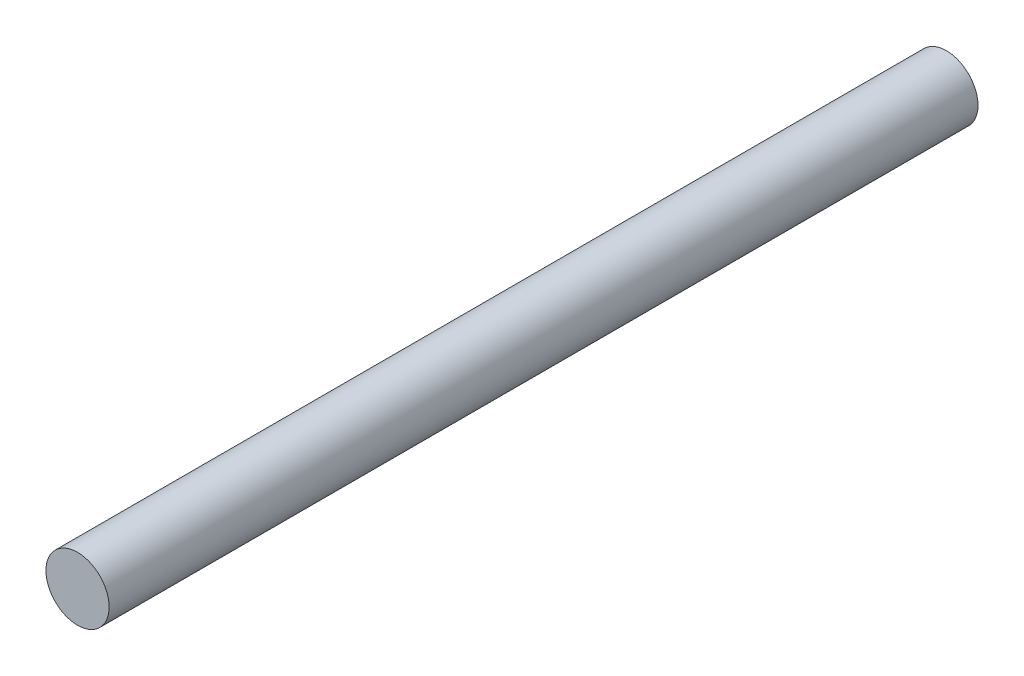
ISO-10303-21;
HEADER;
FILE_DESCRIPTION(('STEP AP214'),'2;1');
FILE_NAME('part.step','',(''),(''),'','','');
FILE_SCHEMA(('AUTOMOTIVE_DESIGN { 1 0 10303 214 1 1 1 1 }'));
ENDSEC;
DATA;
#1=APPLICATION_CONTEXT('core data for automotive mechanical design processes');
#2=APPLICATION_PROTOCOL_DEFINITION('international standard','automotive_design',2000,#1);
#3=PRODUCT_CONTEXT('',#1,'mechanical');
#4=PRODUCT('Part','Part','',(#3));
#5=PRODUCT_RELATED_PRODUCT_CATEGORY('part','',(#4));
#6=PRODUCT_DEFINITION_FORMATION('','',#4);
#7=PRODUCT_DEFINITION_CONTEXT('part definition',#1,'design');
#8=PRODUCT_DEFINITION('design','',#6,#7);
#9=PRODUCT_DEFINITION_SHAPE('','',#8);
#10=(LENGTH_UNIT() NAMED_UNIT(*) SI_UNIT(.MILLI.,.METRE.));
#11=(NAMED_UNIT(*) PLANE_ANGLE_UNIT() SI_UNIT($,.RADIAN.));
#12=(NAMED_UNIT(*) SI_UNIT($,.STERADIAN.) SOLID_ANGLE_UNIT());
#13=UNCERTAINTY_MEASURE_WITH_UNIT(LENGTH_MEASURE(1.E-05),#10,'distance_accuracy_value','');
#14=(GEOMETRIC_REPRESENTATION_CONTEXT(3) GLOBAL_UNCERTAINTY_ASSIGNED_CONTEXT((#13)) GLOBAL_UNIT_ASSIGNED_CONTEXT((#10,
#11,#12)) REPRESENTATION_CONTEXT('',''));
#15=CARTESIAN_POINT('',(0.,0.,0.));
#16=DIRECTION('',(0.,0.,1.));
#17=DIRECTION('',(1.,0.,0.));
#18=AXIS2_PLACEMENT_3D('',#15,#16,#17);
#19=CARTESIAN_POINT('',(0.,0.,16.5));
#20=DIRECTION('',(0.,0.,-1.));
#21=DIRECTION('',(-1.,0.,0.));
#22=AXIS2_PLACEMENT_3D('',#19,#20,#21);
#23=CYLINDRICAL_SURFACE('',#22,0.6);
#24=CARTESIAN_POINT('',(0.,0.,16.5));
#25=DIRECTION('',(0.,0.,1.));
#26=DIRECTION('',(1.,0.,0.));
#27=AXIS2_PLACEMENT_3D('',#24,#25,#26);
#28=CIRCLE('',#27,0.6);
#29=CARTESIAN_POINT('',(0.6,0.,16.5));
#30=VERTEX_POINT('',#29);
#31=EDGE_CURVE('E10',#30,#30,#28,.T.);
#32=ORIENTED_EDGE('',*,*,#31,.F.);
#33=EDGE_LOOP('',(#32));
#34=FACE_BOUND('',#33,.T.);
#35=CARTESIAN_POINT('',(0.,0.,0.));
#36=DIRECTION('',(0.,0.,1.));
#37=DIRECTION('',(1.,0.,0.));
#38=AXIS2_PLACEMENT_3D('',#35,#36,#37);
#39=CIRCLE('',#38,0.6);
#40=CARTESIAN_POINT('',(0.6,0.,0.));
#41=VERTEX_POINT('',#40);
#42=EDGE_CURVE('E34',#41,#41,#39,.T.);
#43=ORIENTED_EDGE('',*,*,#42,.T.);
#44=EDGE_LOOP('',(#43));
#45=FACE_BOUND('',#44,.T.);
#46=ADVANCED_FACE('F31',(#34,#45),#23,.T.);
#47=CARTESIAN_POINT('',(0.,0.,16.5));
#48=DIRECTION('',(0.,0.,1.));
#49=DIRECTION('',(1.,0.,0.));
#50=AXIS2_PLACEMENT_3D('',#47,#48,#49);
#51=PLANE('',#50);
#52=ORIENTED_EDGE('',*,*,#31,.T.);
#53=EDGE_LOOP('',(#52));
#54=FACE_BOUND('',#53,.T.);
#55=ADVANCED_FACE('F46',(#54),#51,.T.);
#56=CARTESIAN_POINT('',(0.,0.,0.));
#57=DIRECTION('',(0.,0.,1.));
#58=DIRECTION('',(1.,0.,0.));
#59=AXIS2_PLACEMENT_3D('',#56,#57,#58);
#60=PLANE('',#59);
#61=ORIENTED_EDGE('',*,*,#42,.F.);
#62=EDGE_LOOP('',(#61));
#63=FACE_BOUND('',#62,.T.);
#64=ADVANCED_FACE('F44',(#63),#60,.F.);
#65=CLOSED_SHELL('',(#46,#55,#64));
#66=MANIFOLD_SOLID_BREP('B2',#65);
#67=ADVANCED_BREP_SHAPE_REPRESENTATION('',(#18,#66),#14);
#68=SHAPE_DEFINITION_REPRESENTATION(#9,#67);
ENDSEC;
END-ISO-10303-21;
